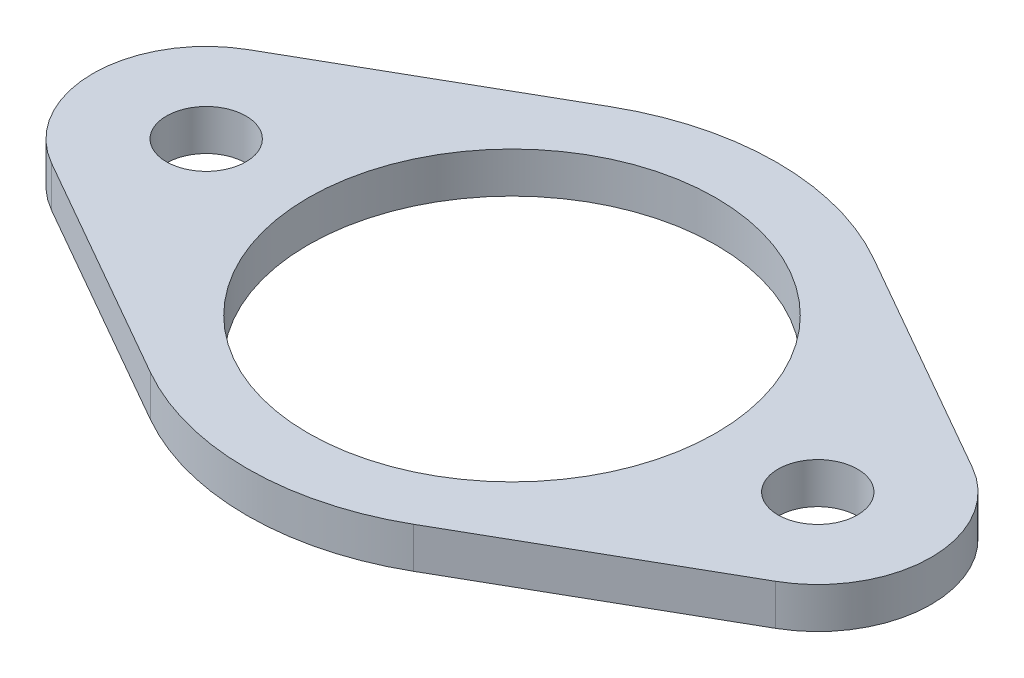
ISO-10303-21;
HEADER;
FILE_DESCRIPTION(('STEP AP214'),'2;1');
FILE_NAME('part.step','',(''),(''),'','','');
FILE_SCHEMA(('AUTOMOTIVE_DESIGN { 1 0 10303 214 1 1 1 1 }'));
ENDSEC;
DATA;
#1=APPLICATION_CONTEXT('core data for automotive mechanical design processes');
#2=APPLICATION_PROTOCOL_DEFINITION('international standard','automotive_design',2000,#1);
#3=PRODUCT_CONTEXT('',#1,'mechanical');
#4=PRODUCT('Part','Part','',(#3));
#5=PRODUCT_RELATED_PRODUCT_CATEGORY('part','',(#4));
#6=PRODUCT_DEFINITION_FORMATION('','',#4);
#7=PRODUCT_DEFINITION_CONTEXT('part definition',#1,'design');
#8=PRODUCT_DEFINITION('design','',#6,#7);
#9=PRODUCT_DEFINITION_SHAPE('','',#8);
#10=(LENGTH_UNIT() NAMED_UNIT(*) SI_UNIT(.MILLI.,.METRE.));
#11=(NAMED_UNIT(*) PLANE_ANGLE_UNIT() SI_UNIT($,.RADIAN.));
#12=(NAMED_UNIT(*) SI_UNIT($,.STERADIAN.) SOLID_ANGLE_UNIT());
#13=UNCERTAINTY_MEASURE_WITH_UNIT(LENGTH_MEASURE(1.E-05),#10,'distance_accuracy_value','');
#14=(GEOMETRIC_REPRESENTATION_CONTEXT(3) GLOBAL_UNCERTAINTY_ASSIGNED_CONTEXT((#13)) GLOBAL_UNIT_ASSIGNED_CONTEXT((#10,
#11,#12)) REPRESENTATION_CONTEXT('',''));
#15=CARTESIAN_POINT('',(0.,0.,0.));
#16=DIRECTION('',(0.,0.,1.));
#17=DIRECTION('',(1.,0.,0.));
#18=AXIS2_PLACEMENT_3D('',#15,#16,#17);
#19=CARTESIAN_POINT('',(-7.5,1.,0.));
#20=DIRECTION('',(0.,1.,0.));
#21=DIRECTION('',(0.,0.,1.));
#22=AXIS2_PLACEMENT_3D('',#19,#20,#21);
#23=PLANE('',#22);
#24=CARTESIAN_POINT('',(-7.5,1.,0.));
#25=DIRECTION('',(0.,1.,0.));
#26=DIRECTION('',(0.,0.,1.));
#27=AXIS2_PLACEMENT_3D('',#24,#25,#26);
#28=CIRCLE('',#27,0.975);
#29=CARTESIAN_POINT('',(-7.5,1.,0.975));
#30=VERTEX_POINT('',#29);
#31=EDGE_CURVE('E216',#30,#30,#28,.T.);
#32=ORIENTED_EDGE('',*,*,#31,.F.);
#33=EDGE_LOOP('',(#32));
#34=FACE_BOUND('',#33,.T.);
#35=CARTESIAN_POINT('',(-7.5,1.,0.));
#36=DIRECTION('',(0.,1.,0.));
#37=DIRECTION('',(0.,0.,1.));
#38=AXIS2_PLACEMENT_3D('',#35,#36,#37);
#39=CIRCLE('',#38,2.78);
#40=CARTESIAN_POINT('',(-8.87888,1.,-2.41393660761835));
#41=VERTEX_POINT('',#40);
#42=CARTESIAN_POINT('',(-8.87888,1.,2.41393660761835));
#43=VERTEX_POINT('',#42);
#44=EDGE_CURVE('E167',#41,#43,#39,.T.);
#45=ORIENTED_EDGE('',*,*,#44,.T.);
#46=DIRECTION('',(0.868322520726026,0.,0.496));
#47=VECTOR('',#46,1.);
#48=CARTESIAN_POINT('',(-8.87888,1.,2.41393660761835));
#49=LINE('',#48,#47);
#50=CARTESIAN_POINT('',(-3.224,1.,5.64409638471917));
#51=VERTEX_POINT('',#50);
#52=EDGE_CURVE('E103',#43,#51,#49,.T.);
#53=ORIENTED_EDGE('',*,*,#52,.T.);
#54=CARTESIAN_POINT('',(0.,1.,0.));
#55=DIRECTION('',(0.,1.,0.));
#56=DIRECTION('',(0.,0.,1.));
#57=AXIS2_PLACEMENT_3D('',#54,#55,#56);
#58=CIRCLE('',#57,6.5);
#59=CARTESIAN_POINT('',(3.224,1.,5.64409638471917));
#60=VERTEX_POINT('',#59);
#61=EDGE_CURVE('E188',#51,#60,#58,.T.);
#62=ORIENTED_EDGE('',*,*,#61,.T.);
#63=DIRECTION('',(0.868322520726026,0.,-0.496));
#64=VECTOR('',#63,1.);
#65=CARTESIAN_POINT('',(8.87888,1.,2.41393660761835));
#66=LINE('',#65,#64);
#67=CARTESIAN_POINT('',(8.87888,1.,2.41393660761835));
#68=VERTEX_POINT('',#67);
#69=EDGE_CURVE('E202',#60,#68,#66,.T.);
#70=ORIENTED_EDGE('',*,*,#69,.T.);
#71=CARTESIAN_POINT('',(7.5,1.,0.));
#72=DIRECTION('',(0.,1.,0.));
#73=DIRECTION('',(0.,0.,-1.));
#74=AXIS2_PLACEMENT_3D('',#71,#72,#73);
#75=CIRCLE('',#74,2.78);
#76=CARTESIAN_POINT('',(8.87888,1.,-2.41393660761835));
#77=VERTEX_POINT('',#76);
#78=EDGE_CURVE('E122',#68,#77,#75,.T.);
#79=ORIENTED_EDGE('',*,*,#78,.T.);
#80=DIRECTION('',(-0.868322520726026,0.,-0.496));
#81=VECTOR('',#80,1.);
#82=CARTESIAN_POINT('',(8.87888,1.,-2.41393660761835));
#83=LINE('',#82,#81);
#84=CARTESIAN_POINT('',(3.224,1.,-5.64409638471917));
#85=VERTEX_POINT('',#84);
#86=EDGE_CURVE('E116',#77,#85,#83,.T.);
#87=ORIENTED_EDGE('',*,*,#86,.T.);
#88=CARTESIAN_POINT('',(0.,1.,0.));
#89=DIRECTION('',(0.,1.,0.));
#90=DIRECTION('',(0.,0.,1.));
#91=AXIS2_PLACEMENT_3D('',#88,#89,#90);
#92=CIRCLE('',#91,6.5);
#93=CARTESIAN_POINT('',(-3.224,1.,-5.64409638471917));
#94=VERTEX_POINT('',#93);
#95=EDGE_CURVE('E120',#85,#94,#92,.T.);
#96=ORIENTED_EDGE('',*,*,#95,.T.);
#97=DIRECTION('',(-0.868322520726026,0.,0.496));
#98=VECTOR('',#97,1.);
#99=CARTESIAN_POINT('',(-8.87888,1.,-2.41393660761835));
#100=LINE('',#99,#98);
#101=EDGE_CURVE('E60',#94,#41,#100,.T.);
#102=ORIENTED_EDGE('',*,*,#101,.T.);
#103=EDGE_LOOP('',(#45,#53,#62,#70,#79,#87,#96,#102));
#104=FACE_BOUND('',#103,.T.);
#105=CARTESIAN_POINT('',(0.,1.,0.));
#106=DIRECTION('',(0.,1.,0.));
#107=DIRECTION('',(0.,0.,1.));
#108=AXIS2_PLACEMENT_3D('',#105,#106,#107);
#109=CIRCLE('',#108,5.);
#110=CARTESIAN_POINT('',(0.,1.,5.));
#111=VERTEX_POINT('',#110);
#112=EDGE_CURVE('E149',#111,#111,#109,.T.);
#113=ORIENTED_EDGE('',*,*,#112,.F.);
#114=EDGE_LOOP('',(#113));
#115=FACE_BOUND('',#114,.T.);
#116=CARTESIAN_POINT('',(7.5,1.,0.));
#117=DIRECTION('',(0.,1.,0.));
#118=DIRECTION('',(0.,0.,1.));
#119=AXIS2_PLACEMENT_3D('',#116,#117,#118);
#120=CIRCLE('',#119,0.975);
#121=CARTESIAN_POINT('',(7.5,1.,0.975));
#122=VERTEX_POINT('',#121);
#123=EDGE_CURVE('E224',#122,#122,#120,.T.);
#124=ORIENTED_EDGE('',*,*,#123,.F.);
#125=EDGE_LOOP('',(#124));
#126=FACE_BOUND('',#125,.T.);
#127=ADVANCED_FACE('F42',(#34,#104,#115,#126),#23,.T.);
#128=CARTESIAN_POINT('',(-7.5,0.,0.));
#129=DIRECTION('',(0.,1.,0.));
#130=DIRECTION('',(0.,0.,1.));
#131=AXIS2_PLACEMENT_3D('',#128,#129,#130);
#132=PLANE('',#131);
#133=CARTESIAN_POINT('',(-7.5,0.,0.));
#134=DIRECTION('',(0.,1.,0.));
#135=DIRECTION('',(0.,0.,1.));
#136=AXIS2_PLACEMENT_3D('',#133,#134,#135);
#137=CIRCLE('',#136,2.78);
#138=CARTESIAN_POINT('',(-8.87888,0.,-2.41393660761835));
#139=VERTEX_POINT('',#138);
#140=CARTESIAN_POINT('',(-8.87888,0.,2.41393660761835));
#141=VERTEX_POINT('',#140);
#142=EDGE_CURVE('E144',#139,#141,#137,.T.);
#143=ORIENTED_EDGE('',*,*,#142,.F.);
#144=DIRECTION('',(-0.868322520726026,0.,0.496));
#145=VECTOR('',#144,1.);
#146=CARTESIAN_POINT('',(-8.87888,0.,-2.41393660761835));
#147=LINE('',#146,#145);
#148=CARTESIAN_POINT('',(-3.224,0.,-5.64409638471917));
#149=VERTEX_POINT('',#148);
#150=EDGE_CURVE('E95',#149,#139,#147,.T.);
#151=ORIENTED_EDGE('',*,*,#150,.F.);
#152=CARTESIAN_POINT('',(0.,0.,0.));
#153=DIRECTION('',(0.,1.,0.));
#154=DIRECTION('',(0.,0.,1.));
#155=AXIS2_PLACEMENT_3D('',#152,#153,#154);
#156=CIRCLE('',#155,6.5);
#157=CARTESIAN_POINT('',(3.224,0.,-5.64409638471917));
#158=VERTEX_POINT('',#157);
#159=EDGE_CURVE('E89',#158,#149,#156,.T.);
#160=ORIENTED_EDGE('',*,*,#159,.F.);
#161=DIRECTION('',(-0.868322520726026,0.,-0.496));
#162=VECTOR('',#161,1.);
#163=CARTESIAN_POINT('',(8.87888,0.,-2.41393660761835));
#164=LINE('',#163,#162);
#165=CARTESIAN_POINT('',(8.87888,0.,-2.41393660761835));
#166=VERTEX_POINT('',#165);
#167=EDGE_CURVE('E131',#166,#158,#164,.T.);
#168=ORIENTED_EDGE('',*,*,#167,.F.);
#169=CARTESIAN_POINT('',(7.5,0.,0.));
#170=DIRECTION('',(0.,1.,0.));
#171=DIRECTION('',(0.,0.,-1.));
#172=AXIS2_PLACEMENT_3D('',#169,#170,#171);
#173=CIRCLE('',#172,2.78);
#174=CARTESIAN_POINT('',(8.87888,0.,2.41393660761835));
#175=VERTEX_POINT('',#174);
#176=EDGE_CURVE('E158',#175,#166,#173,.T.);
#177=ORIENTED_EDGE('',*,*,#176,.F.);
#178=DIRECTION('',(0.868322520726026,0.,-0.496));
#179=VECTOR('',#178,1.);
#180=CARTESIAN_POINT('',(8.87888,0.,2.41393660761835));
#181=LINE('',#180,#179);
#182=CARTESIAN_POINT('',(3.224,0.,5.64409638471917));
#183=VERTEX_POINT('',#182);
#184=EDGE_CURVE('E155',#183,#175,#181,.T.);
#185=ORIENTED_EDGE('',*,*,#184,.F.);
#186=CARTESIAN_POINT('',(0.,0.,0.));
#187=DIRECTION('',(0.,1.,0.));
#188=DIRECTION('',(0.,0.,1.));
#189=AXIS2_PLACEMENT_3D('',#186,#187,#188);
#190=CIRCLE('',#189,6.5);
#191=CARTESIAN_POINT('',(-3.224,0.,5.64409638471917));
#192=VERTEX_POINT('',#191);
#193=EDGE_CURVE('E152',#192,#183,#190,.T.);
#194=ORIENTED_EDGE('',*,*,#193,.F.);
#195=DIRECTION('',(0.868322520726026,0.,0.496));
#196=VECTOR('',#195,1.);
#197=CARTESIAN_POINT('',(-8.87888,0.,2.41393660761835));
#198=LINE('',#197,#196);
#199=EDGE_CURVE('E148',#141,#192,#198,.T.);
#200=ORIENTED_EDGE('',*,*,#199,.F.);
#201=EDGE_LOOP('',(#143,#151,#160,#168,#177,#185,#194,#200));
#202=FACE_BOUND('',#201,.T.);
#203=CARTESIAN_POINT('',(0.,0.,0.));
#204=DIRECTION('',(0.,1.,0.));
#205=DIRECTION('',(0.,0.,1.));
#206=AXIS2_PLACEMENT_3D('',#203,#204,#205);
#207=CIRCLE('',#206,5.);
#208=CARTESIAN_POINT('',(0.,0.,5.));
#209=VERTEX_POINT('',#208);
#210=EDGE_CURVE('E212',#209,#209,#207,.T.);
#211=ORIENTED_EDGE('',*,*,#210,.T.);
#212=EDGE_LOOP('',(#211));
#213=FACE_BOUND('',#212,.T.);
#214=CARTESIAN_POINT('',(-7.5,0.,0.));
#215=DIRECTION('',(0.,1.,0.));
#216=DIRECTION('',(0.,0.,1.));
#217=AXIS2_PLACEMENT_3D('',#214,#215,#216);
#218=CIRCLE('',#217,0.975);
#219=CARTESIAN_POINT('',(-7.5,0.,0.975));
#220=VERTEX_POINT('',#219);
#221=EDGE_CURVE('E220',#220,#220,#218,.T.);
#222=ORIENTED_EDGE('',*,*,#221,.T.);
#223=EDGE_LOOP('',(#222));
#224=FACE_BOUND('',#223,.T.);
#225=CARTESIAN_POINT('',(7.5,0.,0.));
#226=DIRECTION('',(0.,1.,0.));
#227=DIRECTION('',(0.,0.,1.));
#228=AXIS2_PLACEMENT_3D('',#225,#226,#227);
#229=CIRCLE('',#228,0.975);
#230=CARTESIAN_POINT('',(7.5,0.,0.975));
#231=VERTEX_POINT('',#230);
#232=EDGE_CURVE('E228',#231,#231,#229,.T.);
#233=ORIENTED_EDGE('',*,*,#232,.T.);
#234=EDGE_LOOP('',(#233));
#235=FACE_BOUND('',#234,.T.);
#236=ADVANCED_FACE('F192',(#202,#213,#224,#235),#132,.F.);
#237=CARTESIAN_POINT('',(-7.5,1.,0.));
#238=DIRECTION('',(0.,-1.,0.));
#239=DIRECTION('',(0.,0.,-1.));
#240=AXIS2_PLACEMENT_3D('',#237,#238,#239);
#241=CYLINDRICAL_SURFACE('',#240,2.78);
#242=ORIENTED_EDGE('',*,*,#142,.T.);
#243=DIRECTION('',(0.,-1.,0.));
#244=VECTOR('',#243,1.);
#245=CARTESIAN_POINT('',(-8.87888,1.,2.41393660761835));
#246=LINE('',#245,#244);
#247=EDGE_CURVE('E11',#43,#141,#246,.T.);
#248=ORIENTED_EDGE('',*,*,#247,.F.);
#249=ORIENTED_EDGE('',*,*,#44,.F.);
#250=DIRECTION('',(0.,-1.,0.));
#251=VECTOR('',#250,1.);
#252=CARTESIAN_POINT('',(-8.87888,1.,-2.41393660761835));
#253=LINE('',#252,#251);
#254=EDGE_CURVE('E140',#41,#139,#253,.T.);
#255=ORIENTED_EDGE('',*,*,#254,.T.);
#256=EDGE_LOOP('',(#242,#248,#249,#255));
#257=FACE_BOUND('',#256,.T.);
#258=ADVANCED_FACE('F44',(#257),#241,.T.);
#259=CARTESIAN_POINT('',(-8.87888,1.,2.41393660761835));
#260=DIRECTION('',(0.496,0.,-0.868322520726026));
#261=DIRECTION('',(-0.868322520726026,0.,-0.496));
#262=AXIS2_PLACEMENT_3D('',#259,#260,#261);
#263=PLANE('',#262);
#264=ORIENTED_EDGE('',*,*,#199,.T.);
#265=DIRECTION('',(0.,-1.,0.));
#266=VECTOR('',#265,1.);
#267=CARTESIAN_POINT('',(-3.224,1.,5.64409638471917));
#268=LINE('',#267,#266);
#269=EDGE_CURVE('E52',#51,#192,#268,.T.);
#270=ORIENTED_EDGE('',*,*,#269,.F.);
#271=ORIENTED_EDGE('',*,*,#52,.F.);
#272=ORIENTED_EDGE('',*,*,#247,.T.);
#273=EDGE_LOOP('',(#264,#270,#271,#272));
#274=FACE_BOUND('',#273,.T.);
#275=ADVANCED_FACE('F263',(#274),#263,.F.);
#276=CARTESIAN_POINT('',(0.,1.,0.));
#277=DIRECTION('',(0.,-1.,0.));
#278=DIRECTION('',(0.,0.,-1.));
#279=AXIS2_PLACEMENT_3D('',#276,#277,#278);
#280=CYLINDRICAL_SURFACE('',#279,6.5);
#281=ORIENTED_EDGE('',*,*,#193,.T.);
#282=DIRECTION('',(0.,-1.,0.));
#283=VECTOR('',#282,1.);
#284=CARTESIAN_POINT('',(3.224,1.,5.64409638471917));
#285=LINE('',#284,#283);
#286=EDGE_CURVE('E178',#60,#183,#285,.T.);
#287=ORIENTED_EDGE('',*,*,#286,.F.);
#288=ORIENTED_EDGE('',*,*,#61,.F.);
#289=ORIENTED_EDGE('',*,*,#269,.T.);
#290=EDGE_LOOP('',(#281,#287,#288,#289));
#291=FACE_BOUND('',#290,.T.);
#292=ADVANCED_FACE('F186',(#291),#280,.T.);
#293=CARTESIAN_POINT('',(8.87888,1.,2.41393660761835));
#294=DIRECTION('',(-0.496,0.,-0.868322520726026));
#295=DIRECTION('',(-0.868322520726026,0.,0.496));
#296=AXIS2_PLACEMENT_3D('',#293,#294,#295);
#297=PLANE('',#296);
#298=ORIENTED_EDGE('',*,*,#184,.T.);
#299=DIRECTION('',(0.,-1.,0.));
#300=VECTOR('',#299,1.);
#301=CARTESIAN_POINT('',(8.87888,1.,2.41393660761835));
#302=LINE('',#301,#300);
#303=EDGE_CURVE('E174',#68,#175,#302,.T.);
#304=ORIENTED_EDGE('',*,*,#303,.F.);
#305=ORIENTED_EDGE('',*,*,#69,.F.);
#306=ORIENTED_EDGE('',*,*,#286,.T.);
#307=EDGE_LOOP('',(#298,#304,#305,#306));
#308=FACE_BOUND('',#307,.T.);
#309=ADVANCED_FACE('F197',(#308),#297,.F.);
#310=CARTESIAN_POINT('',(7.5,1.,0.));
#311=DIRECTION('',(0.,-1.,0.));
#312=DIRECTION('',(0.,0.,-1.));
#313=AXIS2_PLACEMENT_3D('',#310,#311,#312);
#314=CYLINDRICAL_SURFACE('',#313,2.78);
#315=ORIENTED_EDGE('',*,*,#176,.T.);
#316=DIRECTION('',(0.,-1.,0.));
#317=VECTOR('',#316,1.);
#318=CARTESIAN_POINT('',(8.87888,1.,-2.41393660761835));
#319=LINE('',#318,#317);
#320=EDGE_CURVE('E133',#77,#166,#319,.T.);
#321=ORIENTED_EDGE('',*,*,#320,.F.);
#322=ORIENTED_EDGE('',*,*,#78,.F.);
#323=ORIENTED_EDGE('',*,*,#303,.T.);
#324=EDGE_LOOP('',(#315,#321,#322,#323));
#325=FACE_BOUND('',#324,.T.);
#326=ADVANCED_FACE('F200',(#325),#314,.T.);
#327=CARTESIAN_POINT('',(8.87888,1.,-2.41393660761835));
#328=DIRECTION('',(-0.496,0.,0.868322520726026));
#329=DIRECTION('',(0.868322520726026,0.,0.496));
#330=AXIS2_PLACEMENT_3D('',#327,#328,#329);
#331=PLANE('',#330);
#332=ORIENTED_EDGE('',*,*,#167,.T.);
#333=DIRECTION('',(0.,-1.,0.));
#334=VECTOR('',#333,1.);
#335=CARTESIAN_POINT('',(3.224,1.,-5.64409638471917));
#336=LINE('',#335,#334);
#337=EDGE_CURVE('E128',#85,#158,#336,.T.);
#338=ORIENTED_EDGE('',*,*,#337,.F.);
#339=ORIENTED_EDGE('',*,*,#86,.F.);
#340=ORIENTED_EDGE('',*,*,#320,.T.);
#341=EDGE_LOOP('',(#332,#338,#339,#340));
#342=FACE_BOUND('',#341,.T.);
#343=ADVANCED_FACE('F129',(#342),#331,.F.);
#344=CARTESIAN_POINT('',(0.,1.,0.));
#345=DIRECTION('',(0.,-1.,0.));
#346=DIRECTION('',(0.,0.,-1.));
#347=AXIS2_PLACEMENT_3D('',#344,#345,#346);
#348=CYLINDRICAL_SURFACE('',#347,6.5);
#349=ORIENTED_EDGE('',*,*,#159,.T.);
#350=DIRECTION('',(0.,-1.,0.));
#351=VECTOR('',#350,1.);
#352=CARTESIAN_POINT('',(-3.224,1.,-5.64409638471917));
#353=LINE('',#352,#351);
#354=EDGE_CURVE('E134',#94,#149,#353,.T.);
#355=ORIENTED_EDGE('',*,*,#354,.F.);
#356=ORIENTED_EDGE('',*,*,#95,.F.);
#357=ORIENTED_EDGE('',*,*,#337,.T.);
#358=EDGE_LOOP('',(#349,#355,#356,#357));
#359=FACE_BOUND('',#358,.T.);
#360=ADVANCED_FACE('F136',(#359),#348,.T.);
#361=CARTESIAN_POINT('',(-8.87888,1.,-2.41393660761835));
#362=DIRECTION('',(0.496,0.,0.868322520726026));
#363=DIRECTION('',(0.868322520726026,0.,-0.496));
#364=AXIS2_PLACEMENT_3D('',#361,#362,#363);
#365=PLANE('',#364);
#366=ORIENTED_EDGE('',*,*,#150,.T.);
#367=ORIENTED_EDGE('',*,*,#254,.F.);
#368=ORIENTED_EDGE('',*,*,#101,.F.);
#369=ORIENTED_EDGE('',*,*,#354,.T.);
#370=EDGE_LOOP('',(#366,#367,#368,#369));
#371=FACE_BOUND('',#370,.T.);
#372=ADVANCED_FACE('F251',(#371),#365,.F.);
#373=CARTESIAN_POINT('',(0.,1.,0.));
#374=DIRECTION('',(0.,-1.,0.));
#375=DIRECTION('',(0.,0.,-1.));
#376=AXIS2_PLACEMENT_3D('',#373,#374,#375);
#377=CYLINDRICAL_SURFACE('',#376,5.);
#378=ORIENTED_EDGE('',*,*,#112,.T.);
#379=EDGE_LOOP('',(#378));
#380=FACE_BOUND('',#379,.T.);
#381=ORIENTED_EDGE('',*,*,#210,.F.);
#382=EDGE_LOOP('',(#381));
#383=FACE_BOUND('',#382,.T.);
#384=ADVANCED_FACE('F248',(#380,#383),#377,.F.);
#385=CARTESIAN_POINT('',(-7.5,1.,0.));
#386=DIRECTION('',(0.,-1.,0.));
#387=DIRECTION('',(0.,0.,-1.));
#388=AXIS2_PLACEMENT_3D('',#385,#386,#387);
#389=CYLINDRICAL_SURFACE('',#388,0.975);
#390=ORIENTED_EDGE('',*,*,#31,.T.);
#391=EDGE_LOOP('',(#390));
#392=FACE_BOUND('',#391,.T.);
#393=ORIENTED_EDGE('',*,*,#221,.F.);
#394=EDGE_LOOP('',(#393));
#395=FACE_BOUND('',#394,.T.);
#396=ADVANCED_FACE('F339',(#392,#395),#389,.F.);
#397=CARTESIAN_POINT('',(7.5,1.,0.));
#398=DIRECTION('',(0.,-1.,0.));
#399=DIRECTION('',(0.,0.,-1.));
#400=AXIS2_PLACEMENT_3D('',#397,#398,#399);
#401=CYLINDRICAL_SURFACE('',#400,0.975);
#402=ORIENTED_EDGE('',*,*,#123,.T.);
#403=EDGE_LOOP('',(#402));
#404=FACE_BOUND('',#403,.T.);
#405=ORIENTED_EDGE('',*,*,#232,.F.);
#406=EDGE_LOOP('',(#405));
#407=FACE_BOUND('',#406,.T.);
#408=ADVANCED_FACE('F236',(#404,#407),#401,.F.);
#409=CLOSED_SHELL('',(#127,#236,#258,#275,#292,#309,#326,#343,#360,#372,#384,#396,#408));
#410=MANIFOLD_SOLID_BREP('B2',#409);
#411=ADVANCED_BREP_SHAPE_REPRESENTATION('',(#18,#410),#14);
#412=SHAPE_DEFINITION_REPRESENTATION(#9,#411);
ENDSEC;
END-ISO-10303-21;
